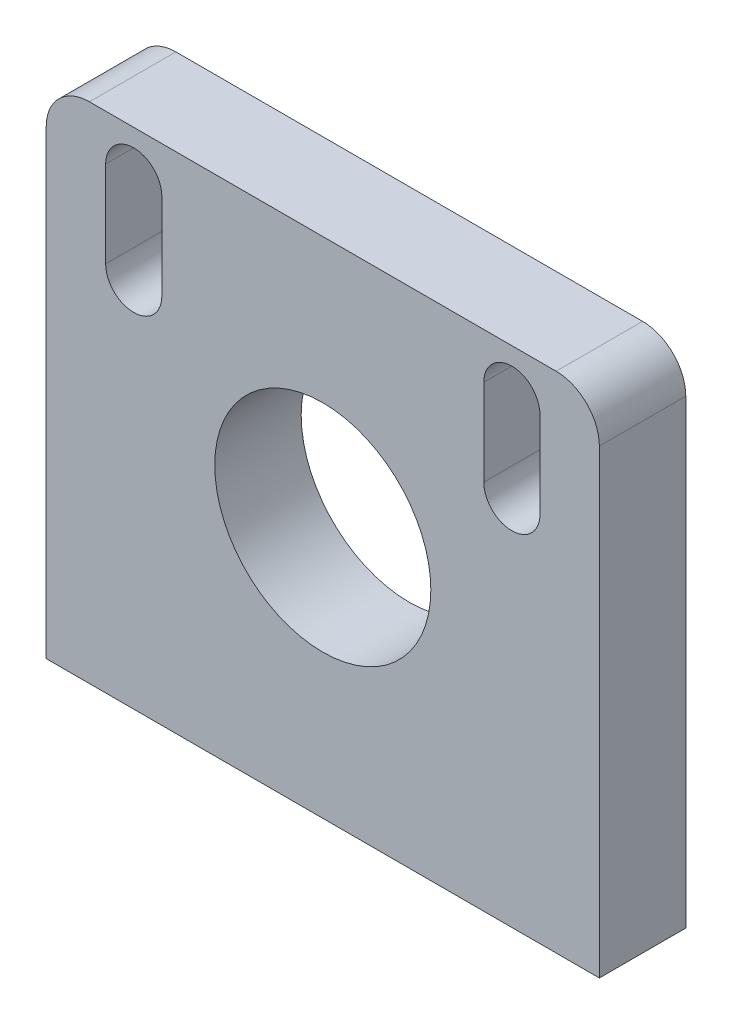
ISO-10303-21;
HEADER;
FILE_DESCRIPTION(('STEP AP214'),'2;1');
FILE_NAME('part.step','',(''),(''),'','','');
FILE_SCHEMA(('AUTOMOTIVE_DESIGN { 1 0 10303 214 1 1 1 1 }'));
ENDSEC;
DATA;
#1=APPLICATION_CONTEXT('core data for automotive mechanical design processes');
#2=APPLICATION_PROTOCOL_DEFINITION('international standard','automotive_design',2000,#1);
#3=PRODUCT_CONTEXT('',#1,'mechanical');
#4=PRODUCT('Part','Part','',(#3));
#5=PRODUCT_RELATED_PRODUCT_CATEGORY('part','',(#4));
#6=PRODUCT_DEFINITION_FORMATION('','',#4);
#7=PRODUCT_DEFINITION_CONTEXT('part definition',#1,'design');
#8=PRODUCT_DEFINITION('design','',#6,#7);
#9=PRODUCT_DEFINITION_SHAPE('','',#8);
#10=(LENGTH_UNIT() NAMED_UNIT(*) SI_UNIT(.MILLI.,.METRE.));
#11=(NAMED_UNIT(*) PLANE_ANGLE_UNIT() SI_UNIT($,.RADIAN.));
#12=(NAMED_UNIT(*) SI_UNIT($,.STERADIAN.) SOLID_ANGLE_UNIT());
#13=UNCERTAINTY_MEASURE_WITH_UNIT(LENGTH_MEASURE(1.E-05),#10,'distance_accuracy_value','');
#14=(GEOMETRIC_REPRESENTATION_CONTEXT(3) GLOBAL_UNCERTAINTY_ASSIGNED_CONTEXT((#13)) GLOBAL_UNIT_ASSIGNED_CONTEXT((#10,
#11,#12)) REPRESENTATION_CONTEXT('',''));
#15=CARTESIAN_POINT('',(0.,0.,0.));
#16=DIRECTION('',(0.,0.,1.));
#17=DIRECTION('',(1.,0.,0.));
#18=AXIS2_PLACEMENT_3D('',#15,#16,#17);
#19=CARTESIAN_POINT('',(25.125,0.,5.));
#20=DIRECTION('',(1.,0.,0.));
#21=DIRECTION('',(0.,1.,0.));
#22=AXIS2_PLACEMENT_3D('',#19,#20,#21);
#23=PLANE('',#22);
#24=DIRECTION('',(0.,-1.,0.));
#25=VECTOR('',#24,1.);
#26=CARTESIAN_POINT('',(25.125,0.,-5.));
#27=LINE('',#26,#25);
#28=CARTESIAN_POINT('',(25.125,23.85,-5.));
#29=VERTEX_POINT('',#28);
#30=CARTESIAN_POINT('',(25.125,13.85,-5.));
#31=VERTEX_POINT('',#30);
#32=EDGE_CURVE('E213',#29,#31,#27,.T.);
#33=ORIENTED_EDGE('',*,*,#32,.T.);
#34=DIRECTION('',(0.,0.,-1.));
#35=VECTOR('',#34,1.);
#36=CARTESIAN_POINT('',(25.125,13.85,5.));
#37=LINE('',#36,#35);
#38=CARTESIAN_POINT('',(25.125,13.85,5.));
#39=VERTEX_POINT('',#38);
#40=EDGE_CURVE('E231',#39,#31,#37,.T.);
#41=ORIENTED_EDGE('',*,*,#40,.F.);
#42=DIRECTION('',(0.,-1.,0.));
#43=VECTOR('',#42,1.);
#44=CARTESIAN_POINT('',(25.125,0.,5.));
#45=LINE('',#44,#43);
#46=CARTESIAN_POINT('',(25.125,23.85,5.));
#47=VERTEX_POINT('',#46);
#48=EDGE_CURVE('E181',#47,#39,#45,.T.);
#49=ORIENTED_EDGE('',*,*,#48,.F.);
#50=DIRECTION('',(0.,0.,-1.));
#51=VECTOR('',#50,1.);
#52=CARTESIAN_POINT('',(25.125,23.85,5.));
#53=LINE('',#52,#51);
#54=EDGE_CURVE('E223',#47,#29,#53,.T.);
#55=ORIENTED_EDGE('',*,*,#54,.T.);
#56=EDGE_LOOP('',(#33,#41,#49,#55));
#57=FACE_BOUND('',#56,.T.);
#58=ADVANCED_FACE('F39',(#57),#23,.F.);
#59=CARTESIAN_POINT('',(21.875,13.85,5.));
#60=DIRECTION('',(0.,0.,-1.));
#61=DIRECTION('',(-1.,0.,0.));
#62=AXIS2_PLACEMENT_3D('',#59,#60,#61);
#63=CYLINDRICAL_SURFACE('',#62,3.25000000000002);
#64=CARTESIAN_POINT('',(21.875,13.85,-5.));
#65=DIRECTION('',(0.,0.,1.));
#66=DIRECTION('',(1.,0.,0.));
#67=AXIS2_PLACEMENT_3D('',#64,#65,#66);
#68=CIRCLE('',#67,3.25000000000002);
#69=CARTESIAN_POINT('',(18.625,13.85,-5.));
#70=VERTEX_POINT('',#69);
#71=EDGE_CURVE('E216',#31,#70,#68,.F.);
#72=ORIENTED_EDGE('',*,*,#71,.T.);
#73=DIRECTION('',(0.,0.,-1.));
#74=VECTOR('',#73,1.);
#75=CARTESIAN_POINT('',(18.625,13.85,5.));
#76=LINE('',#75,#74);
#77=CARTESIAN_POINT('',(18.625,13.85,5.));
#78=VERTEX_POINT('',#77);
#79=EDGE_CURVE('E229',#78,#70,#76,.T.);
#80=ORIENTED_EDGE('',*,*,#79,.F.);
#81=CARTESIAN_POINT('',(21.875,13.85,5.));
#82=DIRECTION('',(0.,0.,1.));
#83=DIRECTION('',(1.,0.,0.));
#84=AXIS2_PLACEMENT_3D('',#81,#82,#83);
#85=CIRCLE('',#84,3.25000000000002);
#86=EDGE_CURVE('E184',#39,#78,#85,.F.);
#87=ORIENTED_EDGE('',*,*,#86,.F.);
#88=ORIENTED_EDGE('',*,*,#40,.T.);
#89=EDGE_LOOP('',(#72,#80,#87,#88));
#90=FACE_BOUND('',#89,.T.);
#91=ADVANCED_FACE('F286',(#90),#63,.F.);
#92=CARTESIAN_POINT('',(18.625,0.,5.));
#93=DIRECTION('',(1.,0.,0.));
#94=DIRECTION('',(0.,1.,0.));
#95=AXIS2_PLACEMENT_3D('',#92,#93,#94);
#96=PLANE('',#95);
#97=DIRECTION('',(0.,-1.,0.));
#98=VECTOR('',#97,1.);
#99=CARTESIAN_POINT('',(18.625,0.,-5.));
#100=LINE('',#99,#98);
#101=CARTESIAN_POINT('',(18.625,23.85,-5.));
#102=VERTEX_POINT('',#101);
#103=EDGE_CURVE('E219',#102,#70,#100,.T.);
#104=ORIENTED_EDGE('',*,*,#103,.F.);
#105=DIRECTION('',(0.,0.,-1.));
#106=VECTOR('',#105,1.);
#107=CARTESIAN_POINT('',(18.625,23.85,5.));
#108=LINE('',#107,#106);
#109=CARTESIAN_POINT('',(18.625,23.85,5.));
#110=VERTEX_POINT('',#109);
#111=EDGE_CURVE('E226',#110,#102,#108,.T.);
#112=ORIENTED_EDGE('',*,*,#111,.F.);
#113=DIRECTION('',(0.,-1.,0.));
#114=VECTOR('',#113,1.);
#115=CARTESIAN_POINT('',(18.625,0.,5.));
#116=LINE('',#115,#114);
#117=EDGE_CURVE('E186',#110,#78,#116,.T.);
#118=ORIENTED_EDGE('',*,*,#117,.T.);
#119=ORIENTED_EDGE('',*,*,#79,.T.);
#120=EDGE_LOOP('',(#104,#112,#118,#119));
#121=FACE_BOUND('',#120,.T.);
#122=ADVANCED_FACE('F278',(#121),#96,.T.);
#123=CARTESIAN_POINT('',(0.,-29.15,5.));
#124=DIRECTION('',(0.,1.,0.));
#125=DIRECTION('',(0.,0.,1.));
#126=AXIS2_PLACEMENT_3D('',#123,#124,#125);
#127=PLANE('',#126);
#128=CARTESIAN_POINT('',(-24.,-29.15,0.));
#129=DIRECTION('',(0.,-1.,0.));
#130=DIRECTION('',(0.,0.,-1.));
#131=AXIS2_PLACEMENT_3D('',#128,#129,#130);
#132=CIRCLE('',#131,2.5);
#133=CARTESIAN_POINT('',(-24.,-29.15,-2.5));
#134=VERTEX_POINT('',#133);
#135=EDGE_CURVE('E431',#134,#134,#132,.T.);
#136=ORIENTED_EDGE('',*,*,#135,.F.);
#137=EDGE_LOOP('',(#136));
#138=FACE_BOUND('',#137,.T.);
#139=CARTESIAN_POINT('',(24.,-29.15,0.));
#140=DIRECTION('',(0.,-1.,0.));
#141=DIRECTION('',(0.,0.,1.));
#142=AXIS2_PLACEMENT_3D('',#139,#140,#141);
#143=CIRCLE('',#142,2.5);
#144=CARTESIAN_POINT('',(24.,-29.15,2.5));
#145=VERTEX_POINT('',#144);
#146=EDGE_CURVE('E427',#145,#145,#143,.T.);
#147=ORIENTED_EDGE('',*,*,#146,.F.);
#148=EDGE_LOOP('',(#147));
#149=FACE_BOUND('',#148,.T.);
#150=DIRECTION('',(1.,0.,0.));
#151=VECTOR('',#150,1.);
#152=CARTESIAN_POINT('',(0.,-29.15,-5.));
#153=LINE('',#152,#151);
#154=CARTESIAN_POINT('',(-32.,-29.15,-5.));
#155=VERTEX_POINT('',#154);
#156=CARTESIAN_POINT('',(32.,-29.15,-5.));
#157=VERTEX_POINT('',#156);
#158=EDGE_CURVE('E202',#155,#157,#153,.T.);
#159=ORIENTED_EDGE('',*,*,#158,.T.);
#160=DIRECTION('',(0.,0.,-1.));
#161=VECTOR('',#160,1.);
#162=CARTESIAN_POINT('',(32.,-29.15,5.));
#163=LINE('',#162,#161);
#164=CARTESIAN_POINT('',(32.,-29.15,5.));
#165=VERTEX_POINT('',#164);
#166=EDGE_CURVE('E227',#165,#157,#163,.T.);
#167=ORIENTED_EDGE('',*,*,#166,.F.);
#168=DIRECTION('',(1.,0.,0.));
#169=VECTOR('',#168,1.);
#170=CARTESIAN_POINT('',(0.,-29.15,5.));
#171=LINE('',#170,#169);
#172=CARTESIAN_POINT('',(-32.,-29.15,5.));
#173=VERTEX_POINT('',#172);
#174=EDGE_CURVE('E171',#173,#165,#171,.T.);
#175=ORIENTED_EDGE('',*,*,#174,.F.);
#176=DIRECTION('',(0.,0.,-1.));
#177=VECTOR('',#176,1.);
#178=CARTESIAN_POINT('',(-32.,-29.15,5.));
#179=LINE('',#178,#177);
#180=EDGE_CURVE('E150',#173,#155,#179,.T.);
#181=ORIENTED_EDGE('',*,*,#180,.T.);
#182=EDGE_LOOP('',(#159,#167,#175,#181));
#183=FACE_BOUND('',#182,.T.);
#184=ADVANCED_FACE('F276',(#138,#149,#183),#127,.F.);
#185=CARTESIAN_POINT('',(32.,0.,5.));
#186=DIRECTION('',(-1.,0.,0.));
#187=DIRECTION('',(0.,0.,1.));
#188=AXIS2_PLACEMENT_3D('',#185,#186,#187);
#189=PLANE('',#188);
#190=DIRECTION('',(0.,1.,0.));
#191=VECTOR('',#190,1.);
#192=CARTESIAN_POINT('',(32.,0.,-5.));
#193=LINE('',#192,#191);
#194=CARTESIAN_POINT('',(32.,24.15,-5.));
#195=VERTEX_POINT('',#194);
#196=EDGE_CURVE('E205',#157,#195,#193,.T.);
#197=ORIENTED_EDGE('',*,*,#196,.T.);
#198=DIRECTION('',(0.,0.,-1.));
#199=VECTOR('',#198,1.);
#200=CARTESIAN_POINT('',(32.,24.15,5.));
#201=LINE('',#200,#199);
#202=CARTESIAN_POINT('',(32.,24.15,5.));
#203=VERTEX_POINT('',#202);
#204=EDGE_CURVE('E11',#195,#203,#201,.F.);
#205=ORIENTED_EDGE('',*,*,#204,.T.);
#206=DIRECTION('',(0.,1.,0.));
#207=VECTOR('',#206,1.);
#208=CARTESIAN_POINT('',(32.,0.,5.));
#209=LINE('',#208,#207);
#210=EDGE_CURVE('E174',#165,#203,#209,.T.);
#211=ORIENTED_EDGE('',*,*,#210,.F.);
#212=ORIENTED_EDGE('',*,*,#166,.T.);
#213=EDGE_LOOP('',(#197,#205,#211,#212));
#214=FACE_BOUND('',#213,.T.);
#215=ADVANCED_FACE('F273',(#214),#189,.F.);
#216=CARTESIAN_POINT('',(0.,29.15,5.));
#217=DIRECTION('',(0.,1.,0.));
#218=DIRECTION('',(0.,0.,1.));
#219=AXIS2_PLACEMENT_3D('',#216,#217,#218);
#220=PLANE('',#219);
#221=DIRECTION('',(1.,0.,0.));
#222=VECTOR('',#221,1.);
#223=CARTESIAN_POINT('',(0.,29.15,-5.));
#224=LINE('',#223,#222);
#225=CARTESIAN_POINT('',(-27.,29.15,-5.));
#226=VERTEX_POINT('',#225);
#227=CARTESIAN_POINT('',(27.,29.15,-5.));
#228=VERTEX_POINT('',#227);
#229=EDGE_CURVE('E207',#226,#228,#224,.T.);
#230=ORIENTED_EDGE('',*,*,#229,.F.);
#231=DIRECTION('',(0.,0.,-1.));
#232=VECTOR('',#231,1.);
#233=CARTESIAN_POINT('',(-27.,29.15,5.));
#234=LINE('',#233,#232);
#235=CARTESIAN_POINT('',(-27.,29.15,5.));
#236=VERTEX_POINT('',#235);
#237=EDGE_CURVE('E251',#226,#236,#234,.F.);
#238=ORIENTED_EDGE('',*,*,#237,.T.);
#239=DIRECTION('',(1.,0.,0.));
#240=VECTOR('',#239,1.);
#241=CARTESIAN_POINT('',(0.,29.15,5.));
#242=LINE('',#241,#240);
#243=CARTESIAN_POINT('',(27.,29.15,5.));
#244=VERTEX_POINT('',#243);
#245=EDGE_CURVE('E176',#236,#244,#242,.T.);
#246=ORIENTED_EDGE('',*,*,#245,.T.);
#247=DIRECTION('',(0.,0.,-1.));
#248=VECTOR('',#247,1.);
#249=CARTESIAN_POINT('',(27.,29.15,-5.));
#250=LINE('',#249,#248);
#251=EDGE_CURVE('E248',#244,#228,#250,.T.);
#252=ORIENTED_EDGE('',*,*,#251,.T.);
#253=EDGE_LOOP('',(#230,#238,#246,#252));
#254=FACE_BOUND('',#253,.T.);
#255=ADVANCED_FACE('F270',(#254),#220,.T.);
#256=CARTESIAN_POINT('',(-21.875,13.85,5.));
#257=DIRECTION('',(0.,0.,-1.));
#258=DIRECTION('',(-1.,0.,0.));
#259=AXIS2_PLACEMENT_3D('',#256,#257,#258);
#260=CYLINDRICAL_SURFACE('',#259,3.25000000000002);
#261=CARTESIAN_POINT('',(-21.875,13.85,-5.));
#262=DIRECTION('',(0.,0.,1.));
#263=DIRECTION('',(1.,0.,0.));
#264=AXIS2_PLACEMENT_3D('',#261,#262,#263);
#265=CIRCLE('',#264,3.25000000000002);
#266=CARTESIAN_POINT('',(-25.125,13.85,-5.));
#267=VERTEX_POINT('',#266);
#268=CARTESIAN_POINT('',(-18.625,13.85,-5.));
#269=VERTEX_POINT('',#268);
#270=EDGE_CURVE('E145',#267,#269,#265,.T.);
#271=ORIENTED_EDGE('',*,*,#270,.F.);
#272=DIRECTION('',(0.,0.,-1.));
#273=VECTOR('',#272,1.);
#274=CARTESIAN_POINT('',(-25.125,13.85,5.));
#275=LINE('',#274,#273);
#276=CARTESIAN_POINT('',(-25.125,13.85,5.));
#277=VERTEX_POINT('',#276);
#278=EDGE_CURVE('E140',#277,#267,#275,.T.);
#279=ORIENTED_EDGE('',*,*,#278,.F.);
#280=CARTESIAN_POINT('',(-21.875,13.85,5.));
#281=DIRECTION('',(0.,0.,1.));
#282=DIRECTION('',(1.,0.,0.));
#283=AXIS2_PLACEMENT_3D('',#280,#281,#282);
#284=CIRCLE('',#283,3.25000000000002);
#285=CARTESIAN_POINT('',(-18.625,13.85,5.));
#286=VERTEX_POINT('',#285);
#287=EDGE_CURVE('E143',#277,#286,#284,.T.);
#288=ORIENTED_EDGE('',*,*,#287,.T.);
#289=DIRECTION('',(0.,0.,-1.));
#290=VECTOR('',#289,1.);
#291=CARTESIAN_POINT('',(-18.625,13.85,5.));
#292=LINE('',#291,#290);
#293=EDGE_CURVE('E191',#286,#269,#292,.T.);
#294=ORIENTED_EDGE('',*,*,#293,.T.);
#295=EDGE_LOOP('',(#271,#279,#288,#294));
#296=FACE_BOUND('',#295,.T.);
#297=ADVANCED_FACE('F142',(#296),#260,.F.);
#298=CARTESIAN_POINT('',(-25.125,0.,5.));
#299=DIRECTION('',(1.,0.,0.));
#300=DIRECTION('',(0.,1.,0.));
#301=AXIS2_PLACEMENT_3D('',#298,#299,#300);
#302=PLANE('',#301);
#303=DIRECTION('',(0.,-1.,0.));
#304=VECTOR('',#303,1.);
#305=CARTESIAN_POINT('',(-25.125,0.,-5.));
#306=LINE('',#305,#304);
#307=CARTESIAN_POINT('',(-25.125,23.85,-5.));
#308=VERTEX_POINT('',#307);
#309=EDGE_CURVE('E193',#308,#267,#306,.T.);
#310=ORIENTED_EDGE('',*,*,#309,.F.);
#311=DIRECTION('',(0.,0.,-1.));
#312=VECTOR('',#311,1.);
#313=CARTESIAN_POINT('',(-25.125,23.85,5.));
#314=LINE('',#313,#312);
#315=CARTESIAN_POINT('',(-25.125,23.85,5.));
#316=VERTEX_POINT('',#315);
#317=EDGE_CURVE('E151',#316,#308,#314,.T.);
#318=ORIENTED_EDGE('',*,*,#317,.F.);
#319=DIRECTION('',(0.,-1.,0.));
#320=VECTOR('',#319,1.);
#321=CARTESIAN_POINT('',(-25.125,0.,5.));
#322=LINE('',#321,#320);
#323=EDGE_CURVE('E157',#316,#277,#322,.T.);
#324=ORIENTED_EDGE('',*,*,#323,.T.);
#325=ORIENTED_EDGE('',*,*,#278,.T.);
#326=EDGE_LOOP('',(#310,#318,#324,#325));
#327=FACE_BOUND('',#326,.T.);
#328=ADVANCED_FACE('F164',(#327),#302,.T.);
#329=CARTESIAN_POINT('',(-21.875,23.85,5.));
#330=DIRECTION('',(0.,0.,-1.));
#331=DIRECTION('',(-1.,0.,0.));
#332=AXIS2_PLACEMENT_3D('',#329,#330,#331);
#333=CYLINDRICAL_SURFACE('',#332,3.25);
#334=CARTESIAN_POINT('',(-21.875,23.85,-5.));
#335=DIRECTION('',(0.,0.,1.));
#336=DIRECTION('',(1.,0.,0.));
#337=AXIS2_PLACEMENT_3D('',#334,#335,#336);
#338=CIRCLE('',#337,3.25);
#339=CARTESIAN_POINT('',(-18.625,23.85,-5.));
#340=VERTEX_POINT('',#339);
#341=EDGE_CURVE('E196',#340,#308,#338,.T.);
#342=ORIENTED_EDGE('',*,*,#341,.F.);
#343=DIRECTION('',(0.,0.,-1.));
#344=VECTOR('',#343,1.);
#345=CARTESIAN_POINT('',(-18.625,23.85,5.));
#346=LINE('',#345,#344);
#347=CARTESIAN_POINT('',(-18.625,23.85,5.));
#348=VERTEX_POINT('',#347);
#349=EDGE_CURVE('E239',#348,#340,#346,.T.);
#350=ORIENTED_EDGE('',*,*,#349,.F.);
#351=CARTESIAN_POINT('',(-21.875,23.85,5.));
#352=DIRECTION('',(0.,0.,1.));
#353=DIRECTION('',(1.,0.,0.));
#354=AXIS2_PLACEMENT_3D('',#351,#352,#353);
#355=CIRCLE('',#354,3.25);
#356=EDGE_CURVE('E165',#348,#316,#355,.T.);
#357=ORIENTED_EDGE('',*,*,#356,.T.);
#358=ORIENTED_EDGE('',*,*,#317,.T.);
#359=EDGE_LOOP('',(#342,#350,#357,#358));
#360=FACE_BOUND('',#359,.T.);
#361=ADVANCED_FACE('F304',(#360),#333,.F.);
#362=CARTESIAN_POINT('',(-32.,0.,5.));
#363=DIRECTION('',(-1.,0.,0.));
#364=DIRECTION('',(0.,0.,1.));
#365=AXIS2_PLACEMENT_3D('',#362,#363,#364);
#366=PLANE('',#365);
#367=DIRECTION('',(0.,1.,0.));
#368=VECTOR('',#367,1.);
#369=CARTESIAN_POINT('',(-32.,0.,5.));
#370=LINE('',#369,#368);
#371=CARTESIAN_POINT('',(-32.,24.15,5.));
#372=VERTEX_POINT('',#371);
#373=EDGE_CURVE('E178',#173,#372,#370,.T.);
#374=ORIENTED_EDGE('',*,*,#373,.T.);
#375=DIRECTION('',(0.,0.,-1.));
#376=VECTOR('',#375,1.);
#377=CARTESIAN_POINT('',(-32.,24.15,5.));
#378=LINE('',#377,#376);
#379=CARTESIAN_POINT('',(-32.,24.15,-5.));
#380=VERTEX_POINT('',#379);
#381=EDGE_CURVE('E234',#372,#380,#378,.T.);
#382=ORIENTED_EDGE('',*,*,#381,.T.);
#383=DIRECTION('',(0.,1.,0.));
#384=VECTOR('',#383,1.);
#385=CARTESIAN_POINT('',(-32.,0.,-5.));
#386=LINE('',#385,#384);
#387=EDGE_CURVE('E210',#155,#380,#386,.T.);
#388=ORIENTED_EDGE('',*,*,#387,.F.);
#389=ORIENTED_EDGE('',*,*,#180,.F.);
#390=EDGE_LOOP('',(#374,#382,#388,#389));
#391=FACE_BOUND('',#390,.T.);
#392=ADVANCED_FACE('F260',(#391),#366,.T.);
#393=CARTESIAN_POINT('',(-18.6249999999999,0.,5.));
#394=DIRECTION('',(1.,0.,0.));
#395=DIRECTION('',(0.,1.,0.));
#396=AXIS2_PLACEMENT_3D('',#393,#394,#395);
#397=PLANE('',#396);
#398=DIRECTION('',(0.,-1.,0.));
#399=VECTOR('',#398,1.);
#400=CARTESIAN_POINT('',(-18.6249999999999,0.,-5.));
#401=LINE('',#400,#399);
#402=EDGE_CURVE('E199',#340,#269,#401,.T.);
#403=ORIENTED_EDGE('',*,*,#402,.T.);
#404=ORIENTED_EDGE('',*,*,#293,.F.);
#405=DIRECTION('',(0.,-1.,0.));
#406=VECTOR('',#405,1.);
#407=CARTESIAN_POINT('',(-18.6249999999999,0.,5.));
#408=LINE('',#407,#406);
#409=EDGE_CURVE('E160',#348,#286,#408,.T.);
#410=ORIENTED_EDGE('',*,*,#409,.F.);
#411=ORIENTED_EDGE('',*,*,#349,.T.);
#412=EDGE_LOOP('',(#403,#404,#410,#411));
#413=FACE_BOUND('',#412,.T.);
#414=ADVANCED_FACE('F303',(#413),#397,.F.);
#415=CARTESIAN_POINT('',(21.875,23.85,5.));
#416=DIRECTION('',(0.,0.,-1.));
#417=DIRECTION('',(-1.,0.,0.));
#418=AXIS2_PLACEMENT_3D('',#415,#416,#417);
#419=CYLINDRICAL_SURFACE('',#418,3.25);
#420=CARTESIAN_POINT('',(21.875,23.85,-5.));
#421=DIRECTION('',(0.,0.,1.));
#422=DIRECTION('',(1.,0.,0.));
#423=AXIS2_PLACEMENT_3D('',#420,#421,#422);
#424=CIRCLE('',#423,3.25);
#425=EDGE_CURVE('E162',#102,#29,#424,.F.);
#426=ORIENTED_EDGE('',*,*,#425,.T.);
#427=ORIENTED_EDGE('',*,*,#54,.F.);
#428=CARTESIAN_POINT('',(21.875,23.85,5.));
#429=DIRECTION('',(0.,0.,1.));
#430=DIRECTION('',(1.,0.,0.));
#431=AXIS2_PLACEMENT_3D('',#428,#429,#430);
#432=CIRCLE('',#431,3.25);
#433=EDGE_CURVE('E189',#110,#47,#432,.F.);
#434=ORIENTED_EDGE('',*,*,#433,.F.);
#435=ORIENTED_EDGE('',*,*,#111,.T.);
#436=EDGE_LOOP('',(#426,#427,#434,#435));
#437=FACE_BOUND('',#436,.T.);
#438=ADVANCED_FACE('F343',(#437),#419,.F.);
#439=CARTESIAN_POINT('',(0.,0.,5.));
#440=DIRECTION('',(0.,0.,1.));
#441=DIRECTION('',(1.,0.,0.));
#442=AXIS2_PLACEMENT_3D('',#439,#440,#441);
#443=PLANE('',#442);
#444=CARTESIAN_POINT('',(0.,0.,5.));
#445=DIRECTION('',(0.,0.,1.));
#446=DIRECTION('',(1.,0.,0.));
#447=AXIS2_PLACEMENT_3D('',#444,#445,#446);
#448=CIRCLE('',#447,12.5);
#449=CARTESIAN_POINT('',(12.5,0.,5.));
#450=VERTEX_POINT('',#449);
#451=EDGE_CURVE('E425',#450,#450,#448,.T.);
#452=ORIENTED_EDGE('',*,*,#451,.F.);
#453=EDGE_LOOP('',(#452));
#454=FACE_BOUND('',#453,.T.);
#455=ORIENTED_EDGE('',*,*,#287,.F.);
#456=ORIENTED_EDGE('',*,*,#323,.F.);
#457=ORIENTED_EDGE('',*,*,#356,.F.);
#458=ORIENTED_EDGE('',*,*,#409,.T.);
#459=EDGE_LOOP('',(#455,#456,#457,#458));
#460=FACE_BOUND('',#459,.T.);
#461=ORIENTED_EDGE('',*,*,#245,.F.);
#462=CARTESIAN_POINT('',(-27.,24.15,5.));
#463=DIRECTION('',(0.,0.,1.));
#464=DIRECTION('',(1.,0.,0.));
#465=AXIS2_PLACEMENT_3D('',#462,#463,#464);
#466=CIRCLE('',#465,5.);
#467=EDGE_CURVE('E47',#236,#372,#466,.T.);
#468=ORIENTED_EDGE('',*,*,#467,.T.);
#469=ORIENTED_EDGE('',*,*,#373,.F.);
#470=ORIENTED_EDGE('',*,*,#174,.T.);
#471=ORIENTED_EDGE('',*,*,#210,.T.);
#472=CARTESIAN_POINT('',(27.,24.15,5.));
#473=DIRECTION('',(0.,0.,1.));
#474=DIRECTION('',(1.,0.,0.));
#475=AXIS2_PLACEMENT_3D('',#472,#473,#474);
#476=CIRCLE('',#475,5.);
#477=EDGE_CURVE('E59',#203,#244,#476,.T.);
#478=ORIENTED_EDGE('',*,*,#477,.T.);
#479=EDGE_LOOP('',(#461,#468,#469,#470,#471,#478));
#480=FACE_BOUND('',#479,.T.);
#481=ORIENTED_EDGE('',*,*,#48,.T.);
#482=ORIENTED_EDGE('',*,*,#86,.T.);
#483=ORIENTED_EDGE('',*,*,#117,.F.);
#484=ORIENTED_EDGE('',*,*,#433,.T.);
#485=EDGE_LOOP('',(#481,#482,#483,#484));
#486=FACE_BOUND('',#485,.T.);
#487=ADVANCED_FACE('F155',(#454,#460,#480,#486),#443,.T.);
#488=CARTESIAN_POINT('',(0.,0.,-5.));
#489=DIRECTION('',(0.,0.,1.));
#490=DIRECTION('',(1.,0.,0.));
#491=AXIS2_PLACEMENT_3D('',#488,#489,#490);
#492=PLANE('',#491);
#493=CARTESIAN_POINT('',(0.,0.,-5.));
#494=DIRECTION('',(0.,0.,1.));
#495=DIRECTION('',(1.,0.,0.));
#496=AXIS2_PLACEMENT_3D('',#493,#494,#495);
#497=CIRCLE('',#496,12.5);
#498=CARTESIAN_POINT('',(12.5,0.,-5.));
#499=VERTEX_POINT('',#498);
#500=EDGE_CURVE('E422',#499,#499,#497,.T.);
#501=ORIENTED_EDGE('',*,*,#500,.T.);
#502=EDGE_LOOP('',(#501));
#503=FACE_BOUND('',#502,.T.);
#504=ORIENTED_EDGE('',*,*,#270,.T.);
#505=ORIENTED_EDGE('',*,*,#402,.F.);
#506=ORIENTED_EDGE('',*,*,#341,.T.);
#507=ORIENTED_EDGE('',*,*,#309,.T.);
#508=EDGE_LOOP('',(#504,#505,#506,#507));
#509=FACE_BOUND('',#508,.T.);
#510=ORIENTED_EDGE('',*,*,#387,.T.);
#511=CARTESIAN_POINT('',(-27.,24.15,-5.));
#512=DIRECTION('',(0.,0.,1.));
#513=DIRECTION('',(1.,0.,0.));
#514=AXIS2_PLACEMENT_3D('',#511,#512,#513);
#515=CIRCLE('',#514,5.);
#516=EDGE_CURVE('E246',#380,#226,#515,.F.);
#517=ORIENTED_EDGE('',*,*,#516,.T.);
#518=ORIENTED_EDGE('',*,*,#229,.T.);
#519=CARTESIAN_POINT('',(27.,24.15,-5.));
#520=DIRECTION('',(0.,0.,1.));
#521=DIRECTION('',(1.,0.,0.));
#522=AXIS2_PLACEMENT_3D('',#519,#520,#521);
#523=CIRCLE('',#522,5.);
#524=EDGE_CURVE('E244',#228,#195,#523,.F.);
#525=ORIENTED_EDGE('',*,*,#524,.T.);
#526=ORIENTED_EDGE('',*,*,#196,.F.);
#527=ORIENTED_EDGE('',*,*,#158,.F.);
#528=EDGE_LOOP('',(#510,#517,#518,#525,#526,#527));
#529=FACE_BOUND('',#528,.T.);
#530=ORIENTED_EDGE('',*,*,#32,.F.);
#531=ORIENTED_EDGE('',*,*,#425,.F.);
#532=ORIENTED_EDGE('',*,*,#103,.T.);
#533=ORIENTED_EDGE('',*,*,#71,.F.);
#534=EDGE_LOOP('',(#530,#531,#532,#533));
#535=FACE_BOUND('',#534,.T.);
#536=ADVANCED_FACE('F266',(#503,#509,#529,#535),#492,.F.);
#537=CARTESIAN_POINT('',(24.,-19.15,0.));
#538=DIRECTION('',(0.,-1.,0.));
#539=DIRECTION('',(0.,0.,-1.));
#540=AXIS2_PLACEMENT_3D('',#537,#538,#539);
#541=CYLINDRICAL_SURFACE('',#540,2.5);
#542=CARTESIAN_POINT('',(24.,-19.15,0.));
#543=DIRECTION('',(0.,-1.,0.));
#544=DIRECTION('',(0.,0.,1.));
#545=AXIS2_PLACEMENT_3D('',#542,#543,#544);
#546=CIRCLE('',#545,2.5);
#547=CARTESIAN_POINT('',(24.,-19.15,2.5));
#548=VERTEX_POINT('',#547);
#549=EDGE_CURVE('E434',#548,#548,#546,.T.);
#550=ORIENTED_EDGE('',*,*,#549,.F.);
#551=EDGE_LOOP('',(#550));
#552=FACE_BOUND('',#551,.T.);
#553=ORIENTED_EDGE('',*,*,#146,.T.);
#554=EDGE_LOOP('',(#553));
#555=FACE_BOUND('',#554,.T.);
#556=ADVANCED_FACE('F336',(#552,#555),#541,.F.);
#557=CARTESIAN_POINT('',(24.,-19.15,0.));
#558=DIRECTION('',(0.,1.,0.));
#559=DIRECTION('',(0.,0.,1.));
#560=AXIS2_PLACEMENT_3D('',#557,#558,#559);
#561=PLANE('',#560);
#562=ORIENTED_EDGE('',*,*,#549,.T.);
#563=EDGE_LOOP('',(#562));
#564=FACE_BOUND('',#563,.T.);
#565=ADVANCED_FACE('F328',(#564),#561,.F.);
#566=CARTESIAN_POINT('',(-24.,-19.15,0.));
#567=DIRECTION('',(0.,-1.,0.));
#568=DIRECTION('',(0.,0.,-1.));
#569=AXIS2_PLACEMENT_3D('',#566,#567,#568);
#570=CYLINDRICAL_SURFACE('',#569,2.5);
#571=CARTESIAN_POINT('',(-24.,-19.15,0.));
#572=DIRECTION('',(0.,-1.,0.));
#573=DIRECTION('',(0.,0.,-1.));
#574=AXIS2_PLACEMENT_3D('',#571,#572,#573);
#575=CIRCLE('',#574,2.5);
#576=CARTESIAN_POINT('',(-24.,-19.15,-2.5));
#577=VERTEX_POINT('',#576);
#578=EDGE_CURVE('E194',#577,#577,#575,.T.);
#579=ORIENTED_EDGE('',*,*,#578,.F.);
#580=EDGE_LOOP('',(#579));
#581=FACE_BOUND('',#580,.T.);
#582=ORIENTED_EDGE('',*,*,#135,.T.);
#583=EDGE_LOOP('',(#582));
#584=FACE_BOUND('',#583,.T.);
#585=ADVANCED_FACE('F322',(#581,#584),#570,.F.);
#586=CARTESIAN_POINT('',(-24.,-19.15,0.));
#587=DIRECTION('',(0.,-1.,0.));
#588=DIRECTION('',(0.,0.,-1.));
#589=AXIS2_PLACEMENT_3D('',#586,#587,#588);
#590=PLANE('',#589);
#591=ORIENTED_EDGE('',*,*,#578,.T.);
#592=EDGE_LOOP('',(#591));
#593=FACE_BOUND('',#592,.T.);
#594=ADVANCED_FACE('F316',(#593),#590,.T.);
#595=CARTESIAN_POINT('',(-27.,24.15,5.));
#596=DIRECTION('',(0.,0.,-1.));
#597=DIRECTION('',(-1.,0.,0.));
#598=AXIS2_PLACEMENT_3D('',#595,#596,#597);
#599=CYLINDRICAL_SURFACE('',#598,5.);
#600=ORIENTED_EDGE('',*,*,#467,.F.);
#601=ORIENTED_EDGE('',*,*,#237,.F.);
#602=ORIENTED_EDGE('',*,*,#516,.F.);
#603=ORIENTED_EDGE('',*,*,#381,.F.);
#604=EDGE_LOOP('',(#600,#601,#602,#603));
#605=FACE_BOUND('',#604,.T.);
#606=ADVANCED_FACE('F263',(#605),#599,.T.);
#607=CARTESIAN_POINT('',(27.,24.15,5.));
#608=DIRECTION('',(0.,0.,1.));
#609=DIRECTION('',(1.,0.,0.));
#610=AXIS2_PLACEMENT_3D('',#607,#608,#609);
#611=CYLINDRICAL_SURFACE('',#610,5.);
#612=ORIENTED_EDGE('',*,*,#477,.F.);
#613=ORIENTED_EDGE('',*,*,#204,.F.);
#614=ORIENTED_EDGE('',*,*,#524,.F.);
#615=ORIENTED_EDGE('',*,*,#251,.F.);
#616=EDGE_LOOP('',(#612,#613,#614,#615));
#617=FACE_BOUND('',#616,.T.);
#618=ADVANCED_FACE('F41',(#617),#611,.T.);
#619=CARTESIAN_POINT('',(0.,0.,-5.));
#620=DIRECTION('',(0.,0.,1.));
#621=DIRECTION('',(1.,0.,0.));
#622=AXIS2_PLACEMENT_3D('',#619,#620,#621);
#623=CYLINDRICAL_SURFACE('',#622,12.5);
#624=ORIENTED_EDGE('',*,*,#500,.F.);
#625=EDGE_LOOP('',(#624));
#626=FACE_BOUND('',#625,.T.);
#627=ORIENTED_EDGE('',*,*,#451,.T.);
#628=EDGE_LOOP('',(#627));
#629=FACE_BOUND('',#628,.T.);
#630=ADVANCED_FACE('F321',(#626,#629),#623,.F.);
#631=CLOSED_SHELL('',(#58,#91,#122,#184,#215,#255,#297,#328,#361,#392,#414,#438,#487,#536,#556,
#565,#585,#594,#606,#618,#630));
#632=MANIFOLD_SOLID_BREP('B2',#631);
#633=ADVANCED_BREP_SHAPE_REPRESENTATION('',(#18,#632),#14);
#634=SHAPE_DEFINITION_REPRESENTATION(#9,#633);
ENDSEC;
END-ISO-10303-21;
